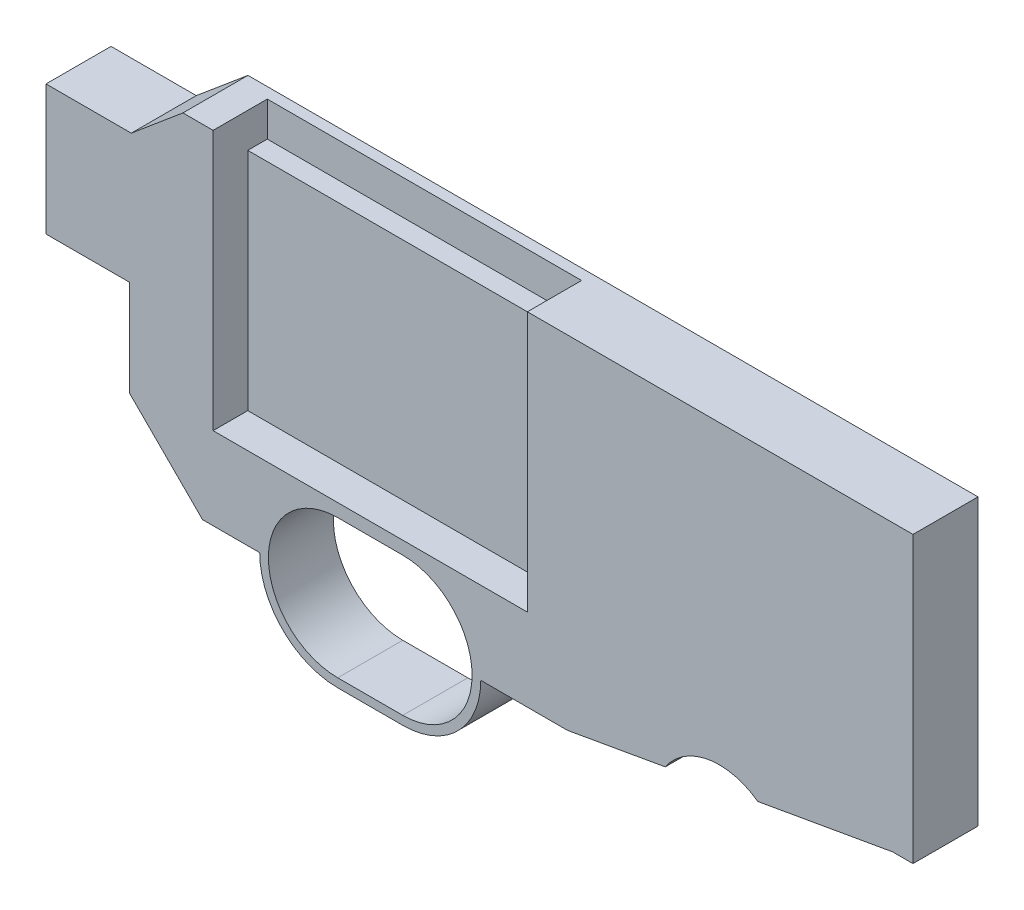
ISO-10303-21;
HEADER;
FILE_DESCRIPTION(('STEP AP214'),'2;1');
FILE_NAME('part.step','',(''),(''),'','','');
FILE_SCHEMA(('AUTOMOTIVE_DESIGN { 1 0 10303 214 1 1 1 1 }'));
ENDSEC;
DATA;
#1=APPLICATION_CONTEXT('core data for automotive mechanical design processes');
#2=APPLICATION_PROTOCOL_DEFINITION('international standard','automotive_design',2000,#1);
#3=PRODUCT_CONTEXT('',#1,'mechanical');
#4=PRODUCT('Part','Part','',(#3));
#5=PRODUCT_RELATED_PRODUCT_CATEGORY('part','',(#4));
#6=PRODUCT_DEFINITION_FORMATION('','',#4);
#7=PRODUCT_DEFINITION_CONTEXT('part definition',#1,'design');
#8=PRODUCT_DEFINITION('design','',#6,#7);
#9=PRODUCT_DEFINITION_SHAPE('','',#8);
#10=(LENGTH_UNIT() NAMED_UNIT(*) SI_UNIT(.MILLI.,.METRE.));
#11=(NAMED_UNIT(*) PLANE_ANGLE_UNIT() SI_UNIT($,.RADIAN.));
#12=(NAMED_UNIT(*) SI_UNIT($,.STERADIAN.) SOLID_ANGLE_UNIT());
#13=UNCERTAINTY_MEASURE_WITH_UNIT(LENGTH_MEASURE(1.E-05),#10,'distance_accuracy_value','');
#14=(GEOMETRIC_REPRESENTATION_CONTEXT(3) GLOBAL_UNCERTAINTY_ASSIGNED_CONTEXT((#13)) GLOBAL_UNIT_ASSIGNED_CONTEXT((#10,
#11,#12)) REPRESENTATION_CONTEXT('',''));
#15=CARTESIAN_POINT('',(0.,0.,0.));
#16=DIRECTION('',(0.,0.,1.));
#17=DIRECTION('',(1.,0.,0.));
#18=AXIS2_PLACEMENT_3D('',#15,#16,#17);
#19=CARTESIAN_POINT('',(0.,-69.,15.));
#20=DIRECTION('',(0.,1.,0.));
#21=DIRECTION('',(-1.,0.,0.));
#22=AXIS2_PLACEMENT_3D('',#19,#20,#21);
#23=PLANE('',#22);
#24=DIRECTION('',(1.,0.,0.));
#25=VECTOR('',#24,1.);
#26=CARTESIAN_POINT('',(0.,-69.,0.));
#27=LINE('',#26,#25);
#28=CARTESIAN_POINT('',(36.1113331220298,-69.,0.));
#29=VERTEX_POINT('',#28);
#30=CARTESIAN_POINT('',(49.2987248652,-69.,0.));
#31=VERTEX_POINT('',#30);
#32=EDGE_CURVE('E240',#29,#31,#27,.T.);
#33=ORIENTED_EDGE('',*,*,#32,.T.);
#34=DIRECTION('',(0.,0.,-1.));
#35=VECTOR('',#34,1.);
#36=CARTESIAN_POINT('',(49.2987248652,-69.,15.));
#37=LINE('',#36,#35);
#38=CARTESIAN_POINT('',(49.2987248652,-69.,15.));
#39=VERTEX_POINT('',#38);
#40=EDGE_CURVE('E11',#39,#31,#37,.T.);
#41=ORIENTED_EDGE('',*,*,#40,.F.);
#42=DIRECTION('',(1.,0.,0.));
#43=VECTOR('',#42,1.);
#44=CARTESIAN_POINT('',(0.,-69.,15.));
#45=LINE('',#44,#43);
#46=CARTESIAN_POINT('',(36.1113331220298,-69.,15.));
#47=VERTEX_POINT('',#46);
#48=EDGE_CURVE('E337',#47,#39,#45,.T.);
#49=ORIENTED_EDGE('',*,*,#48,.F.);
#50=DIRECTION('',(0.,0.,-1.));
#51=VECTOR('',#50,1.);
#52=CARTESIAN_POINT('',(36.1113331220298,-69.,15.));
#53=LINE('',#52,#51);
#54=EDGE_CURVE('E283',#47,#29,#53,.T.);
#55=ORIENTED_EDGE('',*,*,#54,.T.);
#56=EDGE_LOOP('',(#33,#41,#49,#55));
#57=FACE_BOUND('',#56,.T.);
#58=ADVANCED_FACE('F35',(#57),#23,.F.);
#59=CARTESIAN_POINT('',(67.2987248652,-69.,15.));
#60=DIRECTION('',(0.,0.,-1.));
#61=DIRECTION('',(-1.,0.,0.));
#62=AXIS2_PLACEMENT_3D('',#59,#60,#61);
#63=CYLINDRICAL_SURFACE('',#62,18.);
#64=CARTESIAN_POINT('',(67.2987248652,-69.,0.));
#65=DIRECTION('',(0.,0.,1.));
#66=DIRECTION('',(1.,0.,0.));
#67=AXIS2_PLACEMENT_3D('',#64,#65,#66);
#68=CIRCLE('',#67,18.);
#69=CARTESIAN_POINT('',(67.2987248652,-87.,0.));
#70=VERTEX_POINT('',#69);
#71=EDGE_CURVE('E243',#31,#70,#68,.T.);
#72=ORIENTED_EDGE('',*,*,#71,.T.);
#73=DIRECTION('',(0.,0.,-1.));
#74=VECTOR('',#73,1.);
#75=CARTESIAN_POINT('',(67.2987248652,-87.,15.));
#76=LINE('',#75,#74);
#77=CARTESIAN_POINT('',(67.2987248652,-87.,15.));
#78=VERTEX_POINT('',#77);
#79=EDGE_CURVE('E44',#78,#70,#76,.T.);
#80=ORIENTED_EDGE('',*,*,#79,.F.);
#81=CARTESIAN_POINT('',(67.2987248652,-69.,15.));
#82=DIRECTION('',(0.,0.,1.));
#83=DIRECTION('',(1.,0.,0.));
#84=AXIS2_PLACEMENT_3D('',#81,#82,#83);
#85=CIRCLE('',#84,18.);
#86=EDGE_CURVE('E344',#39,#78,#85,.T.);
#87=ORIENTED_EDGE('',*,*,#86,.F.);
#88=ORIENTED_EDGE('',*,*,#40,.T.);
#89=EDGE_LOOP('',(#72,#80,#87,#88));
#90=FACE_BOUND('',#89,.T.);
#91=ADVANCED_FACE('F397',(#90),#63,.T.);
#92=CARTESIAN_POINT('',(0.,-87.,15.));
#93=DIRECTION('',(0.,1.,0.));
#94=DIRECTION('',(0.,0.,1.));
#95=AXIS2_PLACEMENT_3D('',#92,#93,#94);
#96=PLANE('',#95);
#97=DIRECTION('',(1.,0.,0.));
#98=VECTOR('',#97,1.);
#99=CARTESIAN_POINT('',(0.,-87.,0.));
#100=LINE('',#99,#98);
#101=CARTESIAN_POINT('',(82.2987248652,-87.,0.));
#102=VERTEX_POINT('',#101);
#103=EDGE_CURVE('E245',#70,#102,#100,.T.);
#104=ORIENTED_EDGE('',*,*,#103,.T.);
#105=DIRECTION('',(0.,0.,-1.));
#106=VECTOR('',#105,1.);
#107=CARTESIAN_POINT('',(82.2987248652,-87.,15.));
#108=LINE('',#107,#106);
#109=CARTESIAN_POINT('',(82.2987248652,-87.,15.));
#110=VERTEX_POINT('',#109);
#111=EDGE_CURVE('E308',#110,#102,#108,.T.);
#112=ORIENTED_EDGE('',*,*,#111,.F.);
#113=DIRECTION('',(1.,0.,0.));
#114=VECTOR('',#113,1.);
#115=CARTESIAN_POINT('',(0.,-87.,15.));
#116=LINE('',#115,#114);
#117=EDGE_CURVE('E346',#78,#110,#116,.T.);
#118=ORIENTED_EDGE('',*,*,#117,.F.);
#119=ORIENTED_EDGE('',*,*,#79,.T.);
#120=EDGE_LOOP('',(#104,#112,#118,#119));
#121=FACE_BOUND('',#120,.T.);
#122=ADVANCED_FACE('F403',(#121),#96,.F.);
#123=CARTESIAN_POINT('',(82.2987248652,-69.,15.));
#124=DIRECTION('',(0.,0.,-1.));
#125=DIRECTION('',(-1.,0.,0.));
#126=AXIS2_PLACEMENT_3D('',#123,#124,#125);
#127=CYLINDRICAL_SURFACE('',#126,18.);
#128=CARTESIAN_POINT('',(82.2987248652,-69.,0.));
#129=DIRECTION('',(0.,0.,1.));
#130=DIRECTION('',(1.,0.,0.));
#131=AXIS2_PLACEMENT_3D('',#128,#129,#130);
#132=CIRCLE('',#131,18.);
#133=CARTESIAN_POINT('',(100.2987248652,-69.,0.));
#134=VERTEX_POINT('',#133);
#135=EDGE_CURVE('E247',#102,#134,#132,.T.);
#136=ORIENTED_EDGE('',*,*,#135,.T.);
#137=DIRECTION('',(0.,0.,-1.));
#138=VECTOR('',#137,1.);
#139=CARTESIAN_POINT('',(100.2987248652,-69.,15.));
#140=LINE('',#139,#138);
#141=CARTESIAN_POINT('',(100.2987248652,-69.,15.));
#142=VERTEX_POINT('',#141);
#143=EDGE_CURVE('E305',#142,#134,#140,.T.);
#144=ORIENTED_EDGE('',*,*,#143,.F.);
#145=CARTESIAN_POINT('',(82.2987248652,-69.,15.));
#146=DIRECTION('',(0.,0.,1.));
#147=DIRECTION('',(1.,0.,0.));
#148=AXIS2_PLACEMENT_3D('',#145,#146,#147);
#149=CIRCLE('',#148,18.);
#150=EDGE_CURVE('E348',#110,#142,#149,.T.);
#151=ORIENTED_EDGE('',*,*,#150,.F.);
#152=ORIENTED_EDGE('',*,*,#111,.T.);
#153=EDGE_LOOP('',(#136,#144,#151,#152));
#154=FACE_BOUND('',#153,.T.);
#155=ADVANCED_FACE('F567',(#154),#127,.T.);
#156=CARTESIAN_POINT('',(0.,-69.0000000000001,15.));
#157=DIRECTION('',(0.,1.,0.));
#158=DIRECTION('',(-1.,0.,0.));
#159=AXIS2_PLACEMENT_3D('',#156,#157,#158);
#160=PLANE('',#159);
#161=DIRECTION('',(1.,0.,0.));
#162=VECTOR('',#161,1.);
#163=CARTESIAN_POINT('',(0.,-69.0000000000001,0.));
#164=LINE('',#163,#162);
#165=CARTESIAN_POINT('',(120.2987248652,-69.,0.));
#166=VERTEX_POINT('',#165);
#167=EDGE_CURVE('E249',#134,#166,#164,.T.);
#168=ORIENTED_EDGE('',*,*,#167,.T.);
#169=DIRECTION('',(0.,0.,-1.));
#170=VECTOR('',#169,1.);
#171=CARTESIAN_POINT('',(120.2987248652,-69.,15.));
#172=LINE('',#171,#170);
#173=CARTESIAN_POINT('',(120.2987248652,-69.,15.));
#174=VERTEX_POINT('',#173);
#175=EDGE_CURVE('E303',#174,#166,#172,.T.);
#176=ORIENTED_EDGE('',*,*,#175,.F.);
#177=DIRECTION('',(1.,0.,0.));
#178=VECTOR('',#177,1.);
#179=CARTESIAN_POINT('',(0.,-69.0000000000001,15.));
#180=LINE('',#179,#178);
#181=EDGE_CURVE('E350',#142,#174,#180,.T.);
#182=ORIENTED_EDGE('',*,*,#181,.F.);
#183=ORIENTED_EDGE('',*,*,#143,.T.);
#184=EDGE_LOOP('',(#168,#176,#182,#183));
#185=FACE_BOUND('',#184,.T.);
#186=ADVANCED_FACE('F562',(#185),#160,.F.);
#187=CARTESIAN_POINT('',(15.4271453544443,-87.4916889772594,15.));
#188=DIRECTION('',(0.173648177666931,-0.984807753012208,0.));
#189=DIRECTION('',(0.984807753012208,0.173648177666931,0.));
#190=AXIS2_PLACEMENT_3D('',#187,#188,#189);
#191=PLANE('',#190);
#192=DIRECTION('',(-0.984807753012208,-0.173648177666931,0.));
#193=VECTOR('',#192,1.);
#194=CARTESIAN_POINT('',(15.4271453544443,-87.4916889772594,0.));
#195=LINE('',#194,#193);
#196=CARTESIAN_POINT('',(142.85786008007,-65.022215800168,0.));
#197=VERTEX_POINT('',#196);
#198=EDGE_CURVE('E252',#197,#166,#195,.T.);
#199=ORIENTED_EDGE('',*,*,#198,.F.);
#200=DIRECTION('',(0.,0.,-1.));
#201=VECTOR('',#200,1.);
#202=CARTESIAN_POINT('',(142.85786008007,-65.022215800168,15.));
#203=LINE('',#202,#201);
#204=CARTESIAN_POINT('',(142.85786008007,-65.022215800168,15.));
#205=VERTEX_POINT('',#204);
#206=EDGE_CURVE('E301',#205,#197,#203,.T.);
#207=ORIENTED_EDGE('',*,*,#206,.F.);
#208=DIRECTION('',(-0.984807753012208,-0.173648177666931,0.));
#209=VECTOR('',#208,1.);
#210=CARTESIAN_POINT('',(15.4271453544443,-87.4916889772594,15.));
#211=LINE('',#210,#209);
#212=EDGE_CURVE('E352',#205,#174,#211,.T.);
#213=ORIENTED_EDGE('',*,*,#212,.T.);
#214=ORIENTED_EDGE('',*,*,#175,.T.);
#215=EDGE_LOOP('',(#199,#207,#213,#214));
#216=FACE_BOUND('',#215,.T.);
#217=ADVANCED_FACE('F556',(#216),#191,.T.);
#218=CARTESIAN_POINT('',(155.326836155646,-73.3603592162237,15.));
#219=DIRECTION('',(0.,0.,-1.));
#220=DIRECTION('',(-1.,0.,0.));
#221=AXIS2_PLACEMENT_3D('',#218,#219,#220);
#222=CYLINDRICAL_SURFACE('',#221,15.);
#223=CARTESIAN_POINT('',(155.326836155646,-73.3603592162237,0.));
#224=DIRECTION('',(0.,0.,1.));
#225=DIRECTION('',(1.,0.,0.));
#226=AXIS2_PLACEMENT_3D('',#223,#224,#225);
#227=CIRCLE('',#226,15.);
#228=CARTESIAN_POINT('',(164.192027956391,-61.2604263926087,0.));
#229=VERTEX_POINT('',#228);
#230=EDGE_CURVE('E255',#229,#197,#227,.T.);
#231=ORIENTED_EDGE('',*,*,#230,.F.);
#232=DIRECTION('',(0.,0.,-1.));
#233=VECTOR('',#232,1.);
#234=CARTESIAN_POINT('',(164.192027956391,-61.2604263926087,15.));
#235=LINE('',#234,#233);
#236=CARTESIAN_POINT('',(164.192027956391,-61.2604263926087,15.));
#237=VERTEX_POINT('',#236);
#238=EDGE_CURVE('E299',#237,#229,#235,.T.);
#239=ORIENTED_EDGE('',*,*,#238,.F.);
#240=CARTESIAN_POINT('',(155.326836155646,-73.3603592162237,15.));
#241=DIRECTION('',(0.,0.,1.));
#242=DIRECTION('',(1.,0.,0.));
#243=AXIS2_PLACEMENT_3D('',#240,#241,#242);
#244=CIRCLE('',#243,15.);
#245=EDGE_CURVE('E355',#237,#205,#244,.T.);
#246=ORIENTED_EDGE('',*,*,#245,.T.);
#247=ORIENTED_EDGE('',*,*,#206,.T.);
#248=EDGE_LOOP('',(#231,#239,#246,#247));
#249=FACE_BOUND('',#248,.T.);
#250=ADVANCED_FACE('F551',(#249),#222,.F.);
#251=CARTESIAN_POINT('',(15.4271453544441,-87.4916889772591,15.));
#252=DIRECTION('',(-0.173648177666929,0.984807753012208,0.));
#253=DIRECTION('',(-0.984807753012208,-0.173648177666929,0.));
#254=AXIS2_PLACEMENT_3D('',#251,#252,#253);
#255=PLANE('',#254);
#256=DIRECTION('',(0.984807753012208,0.173648177666929,0.));
#257=VECTOR('',#256,1.);
#258=CARTESIAN_POINT('',(15.4271453544441,-87.4916889772591,0.));
#259=LINE('',#258,#257);
#260=CARTESIAN_POINT('',(195.2987248652,-55.7754764468651,0.));
#261=VERTEX_POINT('',#260);
#262=EDGE_CURVE('E258',#229,#261,#259,.T.);
#263=ORIENTED_EDGE('',*,*,#262,.T.);
#264=DIRECTION('',(0.,0.,-1.));
#265=VECTOR('',#264,1.);
#266=CARTESIAN_POINT('',(195.2987248652,-55.7754764468651,15.));
#267=LINE('',#266,#265);
#268=CARTESIAN_POINT('',(195.2987248652,-55.7754764468651,15.));
#269=VERTEX_POINT('',#268);
#270=EDGE_CURVE('E297',#269,#261,#267,.T.);
#271=ORIENTED_EDGE('',*,*,#270,.F.);
#272=DIRECTION('',(0.984807753012208,0.173648177666929,0.));
#273=VECTOR('',#272,1.);
#274=CARTESIAN_POINT('',(15.4271453544441,-87.4916889772591,15.));
#275=LINE('',#274,#273);
#276=EDGE_CURVE('E358',#237,#269,#275,.T.);
#277=ORIENTED_EDGE('',*,*,#276,.F.);
#278=ORIENTED_EDGE('',*,*,#238,.T.);
#279=EDGE_LOOP('',(#263,#271,#277,#278));
#280=FACE_BOUND('',#279,.T.);
#281=ADVANCED_FACE('F548',(#280),#255,.F.);
#282=CARTESIAN_POINT('',(0.,-55.7754764468648,15.));
#283=DIRECTION('',(0.,-1.,0.));
#284=DIRECTION('',(1.,0.,0.));
#285=AXIS2_PLACEMENT_3D('',#282,#283,#284);
#286=PLANE('',#285);
#287=DIRECTION('',(-1.,0.,0.));
#288=VECTOR('',#287,1.);
#289=CARTESIAN_POINT('',(0.,-55.7754764468648,0.));
#290=LINE('',#289,#288);
#291=CARTESIAN_POINT('',(200.,-55.7754764468651,0.));
#292=VERTEX_POINT('',#291);
#293=EDGE_CURVE('E261',#292,#261,#290,.T.);
#294=ORIENTED_EDGE('',*,*,#293,.F.);
#295=DIRECTION('',(0.,0.,-1.));
#296=VECTOR('',#295,1.);
#297=CARTESIAN_POINT('',(200.,-55.7754764468651,15.));
#298=LINE('',#297,#296);
#299=CARTESIAN_POINT('',(200.,-55.7754764468651,15.));
#300=VERTEX_POINT('',#299);
#301=EDGE_CURVE('E295',#300,#292,#298,.T.);
#302=ORIENTED_EDGE('',*,*,#301,.F.);
#303=DIRECTION('',(-1.,0.,0.));
#304=VECTOR('',#303,1.);
#305=CARTESIAN_POINT('',(0.,-55.7754764468648,15.));
#306=LINE('',#305,#304);
#307=EDGE_CURVE('E360',#300,#269,#306,.T.);
#308=ORIENTED_EDGE('',*,*,#307,.T.);
#309=ORIENTED_EDGE('',*,*,#270,.T.);
#310=EDGE_LOOP('',(#294,#302,#308,#309));
#311=FACE_BOUND('',#310,.T.);
#312=ADVANCED_FACE('F544',(#311),#286,.T.);
#313=CARTESIAN_POINT('',(200.,0.,15.));
#314=DIRECTION('',(1.,0.,0.));
#315=DIRECTION('',(0.,0.,-1.));
#316=AXIS2_PLACEMENT_3D('',#313,#314,#315);
#317=PLANE('',#316);
#318=DIRECTION('',(0.,-1.,0.));
#319=VECTOR('',#318,1.);
#320=CARTESIAN_POINT('',(200.,0.,0.));
#321=LINE('',#320,#319);
#322=CARTESIAN_POINT('',(200.,10.,0.));
#323=VERTEX_POINT('',#322);
#324=EDGE_CURVE('E264',#323,#292,#321,.T.);
#325=ORIENTED_EDGE('',*,*,#324,.F.);
#326=DIRECTION('',(0.,0.,-1.));
#327=VECTOR('',#326,1.);
#328=CARTESIAN_POINT('',(200.,10.,15.));
#329=LINE('',#328,#327);
#330=CARTESIAN_POINT('',(200.,10.,15.));
#331=VERTEX_POINT('',#330);
#332=EDGE_CURVE('E293',#331,#323,#329,.T.);
#333=ORIENTED_EDGE('',*,*,#332,.F.);
#334=DIRECTION('',(0.,-1.,0.));
#335=VECTOR('',#334,1.);
#336=CARTESIAN_POINT('',(200.,0.,15.));
#337=LINE('',#336,#335);
#338=EDGE_CURVE('E363',#331,#300,#337,.T.);
#339=ORIENTED_EDGE('',*,*,#338,.T.);
#340=ORIENTED_EDGE('',*,*,#301,.T.);
#341=EDGE_LOOP('',(#325,#333,#339,#340));
#342=FACE_BOUND('',#341,.T.);
#343=ADVANCED_FACE('F541',(#342),#317,.T.);
#344=CARTESIAN_POINT('',(0.,10.,15.));
#345=DIRECTION('',(0.,1.,0.));
#346=DIRECTION('',(0.,0.,1.));
#347=AXIS2_PLACEMENT_3D('',#344,#345,#346);
#348=PLANE('',#347);
#349=DIRECTION('',(0.,0.,1.));
#350=VECTOR('',#349,1.);
#351=CARTESIAN_POINT('',(38.5487248652,10.,2.5));
#352=LINE('',#351,#350);
#353=CARTESIAN_POINT('',(38.5487248652,10.,2.5));
#354=VERTEX_POINT('',#353);
#355=CARTESIAN_POINT('',(38.5487248652,10.,15.));
#356=VERTEX_POINT('',#355);
#357=EDGE_CURVE('E477',#354,#356,#352,.T.);
#358=ORIENTED_EDGE('',*,*,#357,.F.);
#359=DIRECTION('',(-1.,0.,0.));
#360=VECTOR('',#359,1.);
#361=CARTESIAN_POINT('',(38.5487248652,10.,2.5));
#362=LINE('',#361,#360);
#363=CARTESIAN_POINT('',(111.0487248652,10.,2.5));
#364=VERTEX_POINT('',#363);
#365=EDGE_CURVE('E465',#364,#354,#362,.T.);
#366=ORIENTED_EDGE('',*,*,#365,.F.);
#367=DIRECTION('',(0.,0.,1.));
#368=VECTOR('',#367,1.);
#369=CARTESIAN_POINT('',(111.0487248652,10.,2.5));
#370=LINE('',#369,#368);
#371=CARTESIAN_POINT('',(111.0487248652,10.,15.));
#372=VERTEX_POINT('',#371);
#373=EDGE_CURVE('E479',#364,#372,#370,.T.);
#374=ORIENTED_EDGE('',*,*,#373,.T.);
#375=DIRECTION('',(1.,0.,0.));
#376=VECTOR('',#375,1.);
#377=CARTESIAN_POINT('',(0.,10.,15.));
#378=LINE('',#377,#376);
#379=EDGE_CURVE('E366',#372,#331,#378,.T.);
#380=ORIENTED_EDGE('',*,*,#379,.T.);
#381=ORIENTED_EDGE('',*,*,#332,.T.);
#382=DIRECTION('',(1.,0.,0.));
#383=VECTOR('',#382,1.);
#384=CARTESIAN_POINT('',(0.,10.,0.));
#385=LINE('',#384,#383);
#386=CARTESIAN_POINT('',(31.588778807741,10.,0.));
#387=VERTEX_POINT('',#386);
#388=EDGE_CURVE('E267',#387,#323,#385,.T.);
#389=ORIENTED_EDGE('',*,*,#388,.F.);
#390=DIRECTION('',(0.,0.,-1.));
#391=VECTOR('',#390,1.);
#392=CARTESIAN_POINT('',(31.588778807741,10.,15.));
#393=LINE('',#392,#391);
#394=CARTESIAN_POINT('',(31.588778807741,10.,15.));
#395=VERTEX_POINT('',#394);
#396=EDGE_CURVE('E291',#395,#387,#393,.T.);
#397=ORIENTED_EDGE('',*,*,#396,.F.);
#398=EDGE_CURVE('E367',#395,#356,#378,.T.);
#399=ORIENTED_EDGE('',*,*,#398,.T.);
#400=EDGE_LOOP('',(#358,#366,#374,#380,#381,#389,#397,#399));
#401=FACE_BOUND('',#400,.T.);
#402=ADVANCED_FACE('F525',(#401),#348,.T.);
#403=CARTESIAN_POINT('',(8.12768370146549,-9.68619625069088,15.));
#404=DIRECTION('',(-0.64278760968654,0.766044443118977,0.));
#405=DIRECTION('',(-0.766044443118977,-0.64278760968654,0.));
#406=AXIS2_PLACEMENT_3D('',#403,#404,#405);
#407=PLANE('',#406);
#408=DIRECTION('',(0.766044443118977,0.64278760968654,0.));
#409=VECTOR('',#408,1.);
#410=CARTESIAN_POINT('',(8.12768370146549,-9.68619625069088,0.));
#411=LINE('',#410,#409);
#412=CARTESIAN_POINT('',(19.6712428817989,0.,0.));
#413=VERTEX_POINT('',#412);
#414=EDGE_CURVE('E270',#413,#387,#411,.T.);
#415=ORIENTED_EDGE('',*,*,#414,.F.);
#416=DIRECTION('',(0.,0.,-1.));
#417=VECTOR('',#416,1.);
#418=CARTESIAN_POINT('',(19.6712428817989,0.,15.));
#419=LINE('',#418,#417);
#420=CARTESIAN_POINT('',(19.6712428817989,0.,15.));
#421=VERTEX_POINT('',#420);
#422=EDGE_CURVE('E289',#421,#413,#419,.T.);
#423=ORIENTED_EDGE('',*,*,#422,.F.);
#424=DIRECTION('',(0.766044443118977,0.64278760968654,0.));
#425=VECTOR('',#424,1.);
#426=CARTESIAN_POINT('',(8.12768370146549,-9.68619625069088,15.));
#427=LINE('',#426,#425);
#428=EDGE_CURVE('E370',#421,#395,#427,.T.);
#429=ORIENTED_EDGE('',*,*,#428,.T.);
#430=ORIENTED_EDGE('',*,*,#396,.T.);
#431=EDGE_LOOP('',(#415,#423,#429,#430));
#432=FACE_BOUND('',#431,.T.);
#433=ADVANCED_FACE('F382',(#432),#407,.T.);
#434=CARTESIAN_POINT('',(0.,0.,15.));
#435=DIRECTION('',(0.,1.,0.));
#436=DIRECTION('',(0.,0.,1.));
#437=AXIS2_PLACEMENT_3D('',#434,#435,#436);
#438=PLANE('',#437);
#439=DIRECTION('',(1.,0.,0.));
#440=VECTOR('',#439,1.);
#441=CARTESIAN_POINT('',(0.,0.,0.));
#442=LINE('',#441,#440);
#443=CARTESIAN_POINT('',(0.,0.,0.));
#444=VERTEX_POINT('',#443);
#445=EDGE_CURVE('E273',#444,#413,#442,.T.);
#446=ORIENTED_EDGE('',*,*,#445,.F.);
#447=DIRECTION('',(0.,0.,-1.));
#448=VECTOR('',#447,1.);
#449=CARTESIAN_POINT('',(0.,0.,15.));
#450=LINE('',#449,#448);
#451=CARTESIAN_POINT('',(0.,0.,15.));
#452=VERTEX_POINT('',#451);
#453=EDGE_CURVE('E287',#452,#444,#450,.T.);
#454=ORIENTED_EDGE('',*,*,#453,.F.);
#455=DIRECTION('',(1.,0.,0.));
#456=VECTOR('',#455,1.);
#457=CARTESIAN_POINT('',(0.,0.,15.));
#458=LINE('',#457,#456);
#459=EDGE_CURVE('E373',#452,#421,#458,.T.);
#460=ORIENTED_EDGE('',*,*,#459,.T.);
#461=ORIENTED_EDGE('',*,*,#422,.T.);
#462=EDGE_LOOP('',(#446,#454,#460,#461));
#463=FACE_BOUND('',#462,.T.);
#464=ADVANCED_FACE('F377',(#463),#438,.T.);
#465=CARTESIAN_POINT('',(0.,0.,15.));
#466=DIRECTION('',(1.,0.,0.));
#467=DIRECTION('',(0.,1.,0.));
#468=AXIS2_PLACEMENT_3D('',#465,#466,#467);
#469=PLANE('',#468);
#470=DIRECTION('',(0.,-1.,0.));
#471=VECTOR('',#470,1.);
#472=CARTESIAN_POINT('',(0.,0.,0.));
#473=LINE('',#472,#471);
#474=CARTESIAN_POINT('',(0.,-30.,0.));
#475=VERTEX_POINT('',#474);
#476=EDGE_CURVE('E276',#444,#475,#473,.T.);
#477=ORIENTED_EDGE('',*,*,#476,.T.);
#478=DIRECTION('',(0.,0.,-1.));
#479=VECTOR('',#478,1.);
#480=CARTESIAN_POINT('',(0.,-30.,15.));
#481=LINE('',#480,#479);
#482=CARTESIAN_POINT('',(0.,-30.,15.));
#483=VERTEX_POINT('',#482);
#484=EDGE_CURVE('E218',#483,#475,#481,.T.);
#485=ORIENTED_EDGE('',*,*,#484,.F.);
#486=DIRECTION('',(0.,-1.,0.));
#487=VECTOR('',#486,1.);
#488=CARTESIAN_POINT('',(0.,0.,15.));
#489=LINE('',#488,#487);
#490=EDGE_CURVE('E206',#452,#483,#489,.T.);
#491=ORIENTED_EDGE('',*,*,#490,.F.);
#492=ORIENTED_EDGE('',*,*,#453,.T.);
#493=EDGE_LOOP('',(#477,#485,#491,#492));
#494=FACE_BOUND('',#493,.T.);
#495=ADVANCED_FACE('F387',(#494),#469,.F.);
#496=CARTESIAN_POINT('',(0.,-30.,15.));
#497=DIRECTION('',(0.,1.,0.));
#498=DIRECTION('',(0.,0.,1.));
#499=AXIS2_PLACEMENT_3D('',#496,#497,#498);
#500=PLANE('',#499);
#501=DIRECTION('',(1.,0.,0.));
#502=VECTOR('',#501,1.);
#503=CARTESIAN_POINT('',(0.,-30.,0.));
#504=LINE('',#503,#502);
#505=CARTESIAN_POINT('',(19.2987248652,-30.,0.));
#506=VERTEX_POINT('',#505);
#507=EDGE_CURVE('E215',#475,#506,#504,.T.);
#508=ORIENTED_EDGE('',*,*,#507,.T.);
#509=DIRECTION('',(0.,0.,-1.));
#510=VECTOR('',#509,1.);
#511=CARTESIAN_POINT('',(19.2987248652,-30.,15.));
#512=LINE('',#511,#510);
#513=CARTESIAN_POINT('',(19.2987248652,-30.,15.));
#514=VERTEX_POINT('',#513);
#515=EDGE_CURVE('E212',#514,#506,#512,.T.);
#516=ORIENTED_EDGE('',*,*,#515,.F.);
#517=DIRECTION('',(1.,0.,0.));
#518=VECTOR('',#517,1.);
#519=CARTESIAN_POINT('',(0.,-30.,15.));
#520=LINE('',#519,#518);
#521=EDGE_CURVE('E197',#483,#514,#520,.T.);
#522=ORIENTED_EDGE('',*,*,#521,.F.);
#523=ORIENTED_EDGE('',*,*,#484,.T.);
#524=EDGE_LOOP('',(#508,#516,#522,#523));
#525=FACE_BOUND('',#524,.T.);
#526=ADVANCED_FACE('F213',(#525),#500,.F.);
#527=CARTESIAN_POINT('',(19.2987248652,0.,15.));
#528=DIRECTION('',(1.,0.,0.));
#529=DIRECTION('',(0.,1.,0.));
#530=AXIS2_PLACEMENT_3D('',#527,#528,#529);
#531=PLANE('',#530);
#532=DIRECTION('',(0.,-1.,0.));
#533=VECTOR('',#532,1.);
#534=CARTESIAN_POINT('',(19.2987248652,0.,0.));
#535=LINE('',#534,#533);
#536=CARTESIAN_POINT('',(19.2987248652,-52.1873917431703,0.));
#537=VERTEX_POINT('',#536);
#538=EDGE_CURVE('E279',#506,#537,#535,.T.);
#539=ORIENTED_EDGE('',*,*,#538,.T.);
#540=DIRECTION('',(0.,0.,-1.));
#541=VECTOR('',#540,1.);
#542=CARTESIAN_POINT('',(19.2987248652,-52.1873917431703,15.));
#543=LINE('',#542,#541);
#544=CARTESIAN_POINT('',(19.2987248652,-52.1873917431703,15.));
#545=VERTEX_POINT('',#544);
#546=EDGE_CURVE('E219',#545,#537,#543,.T.);
#547=ORIENTED_EDGE('',*,*,#546,.F.);
#548=DIRECTION('',(0.,-1.,0.));
#549=VECTOR('',#548,1.);
#550=CARTESIAN_POINT('',(19.2987248652,0.,15.));
#551=LINE('',#550,#549);
#552=EDGE_CURVE('E202',#514,#545,#551,.T.);
#553=ORIENTED_EDGE('',*,*,#552,.F.);
#554=ORIENTED_EDGE('',*,*,#515,.T.);
#555=EDGE_LOOP('',(#539,#547,#553,#554));
#556=FACE_BOUND('',#555,.T.);
#557=ADVANCED_FACE('F221',(#556),#531,.F.);
#558=CARTESIAN_POINT('',(82.2987248652,-69.,15.));
#559=DIRECTION('',(0.,0.,-1.));
#560=DIRECTION('',(-1.,0.,0.));
#561=AXIS2_PLACEMENT_3D('',#558,#559,#560);
#562=CYLINDRICAL_SURFACE('',#561,16.);
#563=CARTESIAN_POINT('',(82.2987248652,-69.,0.));
#564=DIRECTION('',(0.,0.,1.));
#565=DIRECTION('',(1.,0.,0.));
#566=AXIS2_PLACEMENT_3D('',#563,#564,#565);
#567=CIRCLE('',#566,16.);
#568=CARTESIAN_POINT('',(82.2987248652,-85.,0.));
#569=VERTEX_POINT('',#568);
#570=CARTESIAN_POINT('',(82.2987248652,-53.,0.));
#571=VERTEX_POINT('',#570);
#572=EDGE_CURVE('E227',#569,#571,#567,.T.);
#573=ORIENTED_EDGE('',*,*,#572,.F.);
#574=DIRECTION('',(0.,0.,-1.));
#575=VECTOR('',#574,1.);
#576=CARTESIAN_POINT('',(82.2987248652,-85.,15.));
#577=LINE('',#576,#575);
#578=CARTESIAN_POINT('',(82.2987248652,-85.,15.));
#579=VERTEX_POINT('',#578);
#580=EDGE_CURVE('E39',#579,#569,#577,.T.);
#581=ORIENTED_EDGE('',*,*,#580,.F.);
#582=CARTESIAN_POINT('',(82.2987248652,-69.,15.));
#583=DIRECTION('',(0.,0.,1.));
#584=DIRECTION('',(1.,0.,0.));
#585=AXIS2_PLACEMENT_3D('',#582,#583,#584);
#586=CIRCLE('',#585,16.);
#587=CARTESIAN_POINT('',(82.2987248652,-53.,15.));
#588=VERTEX_POINT('',#587);
#589=EDGE_CURVE('E282',#579,#588,#586,.T.);
#590=ORIENTED_EDGE('',*,*,#589,.T.);
#591=DIRECTION('',(0.,0.,-1.));
#592=VECTOR('',#591,1.);
#593=CARTESIAN_POINT('',(82.2987248652,-53.,15.));
#594=LINE('',#593,#592);
#595=EDGE_CURVE('E223',#588,#571,#594,.T.);
#596=ORIENTED_EDGE('',*,*,#595,.T.);
#597=EDGE_LOOP('',(#573,#581,#590,#596));
#598=FACE_BOUND('',#597,.T.);
#599=ADVANCED_FACE('F37',(#598),#562,.F.);
#600=CARTESIAN_POINT('',(0.,-85.,15.));
#601=DIRECTION('',(0.,1.,0.));
#602=DIRECTION('',(0.,0.,1.));
#603=AXIS2_PLACEMENT_3D('',#600,#601,#602);
#604=PLANE('',#603);
#605=DIRECTION('',(1.,0.,0.));
#606=VECTOR('',#605,1.);
#607=CARTESIAN_POINT('',(0.,-85.,0.));
#608=LINE('',#607,#606);
#609=CARTESIAN_POINT('',(67.2987248652,-85.,0.));
#610=VERTEX_POINT('',#609);
#611=EDGE_CURVE('E230',#610,#569,#608,.T.);
#612=ORIENTED_EDGE('',*,*,#611,.F.);
#613=DIRECTION('',(0.,0.,-1.));
#614=VECTOR('',#613,1.);
#615=CARTESIAN_POINT('',(67.2987248652,-85.,15.));
#616=LINE('',#615,#614);
#617=CARTESIAN_POINT('',(67.2987248652,-85.,15.));
#618=VERTEX_POINT('',#617);
#619=EDGE_CURVE('E315',#618,#610,#616,.T.);
#620=ORIENTED_EDGE('',*,*,#619,.F.);
#621=DIRECTION('',(1.,0.,0.));
#622=VECTOR('',#621,1.);
#623=CARTESIAN_POINT('',(0.,-85.,15.));
#624=LINE('',#623,#622);
#625=EDGE_CURVE('E324',#618,#579,#624,.T.);
#626=ORIENTED_EDGE('',*,*,#625,.T.);
#627=ORIENTED_EDGE('',*,*,#580,.T.);
#628=EDGE_LOOP('',(#612,#620,#626,#627));
#629=FACE_BOUND('',#628,.T.);
#630=ADVANCED_FACE('F322',(#629),#604,.T.);
#631=CARTESIAN_POINT('',(67.2987248652,-69.,15.));
#632=DIRECTION('',(0.,0.,-1.));
#633=DIRECTION('',(-1.,0.,0.));
#634=AXIS2_PLACEMENT_3D('',#631,#632,#633);
#635=CYLINDRICAL_SURFACE('',#634,16.);
#636=CARTESIAN_POINT('',(67.2987248652,-69.,0.));
#637=DIRECTION('',(0.,0.,1.));
#638=DIRECTION('',(1.,0.,0.));
#639=AXIS2_PLACEMENT_3D('',#636,#637,#638);
#640=CIRCLE('',#639,16.);
#641=CARTESIAN_POINT('',(67.2987248652,-53.,0.));
#642=VERTEX_POINT('',#641);
#643=EDGE_CURVE('E234',#642,#610,#640,.T.);
#644=ORIENTED_EDGE('',*,*,#643,.F.);
#645=DIRECTION('',(0.,0.,-1.));
#646=VECTOR('',#645,1.);
#647=CARTESIAN_POINT('',(67.2987248652,-53.,15.));
#648=LINE('',#647,#646);
#649=CARTESIAN_POINT('',(67.2987248652,-53.,15.));
#650=VERTEX_POINT('',#649);
#651=EDGE_CURVE('E314',#650,#642,#648,.T.);
#652=ORIENTED_EDGE('',*,*,#651,.F.);
#653=CARTESIAN_POINT('',(67.2987248652,-69.,15.));
#654=DIRECTION('',(0.,0.,1.));
#655=DIRECTION('',(1.,0.,0.));
#656=AXIS2_PLACEMENT_3D('',#653,#654,#655);
#657=CIRCLE('',#656,16.);
#658=EDGE_CURVE('E333',#650,#618,#657,.T.);
#659=ORIENTED_EDGE('',*,*,#658,.T.);
#660=ORIENTED_EDGE('',*,*,#619,.T.);
#661=EDGE_LOOP('',(#644,#652,#659,#660));
#662=FACE_BOUND('',#661,.T.);
#663=ADVANCED_FACE('F330',(#662),#635,.F.);
#664=CARTESIAN_POINT('',(0.,-53.,15.));
#665=DIRECTION('',(0.,1.,0.));
#666=DIRECTION('',(-1.,0.,0.));
#667=AXIS2_PLACEMENT_3D('',#664,#665,#666);
#668=PLANE('',#667);
#669=DIRECTION('',(1.,0.,0.));
#670=VECTOR('',#669,1.);
#671=CARTESIAN_POINT('',(0.,-53.,0.));
#672=LINE('',#671,#670);
#673=EDGE_CURVE('E237',#642,#571,#672,.T.);
#674=ORIENTED_EDGE('',*,*,#673,.T.);
#675=ORIENTED_EDGE('',*,*,#595,.F.);
#676=DIRECTION('',(1.,0.,0.));
#677=VECTOR('',#676,1.);
#678=CARTESIAN_POINT('',(0.,-53.,15.));
#679=LINE('',#678,#677);
#680=EDGE_CURVE('E335',#650,#588,#679,.T.);
#681=ORIENTED_EDGE('',*,*,#680,.F.);
#682=ORIENTED_EDGE('',*,*,#651,.T.);
#683=EDGE_LOOP('',(#674,#675,#681,#682));
#684=FACE_BOUND('',#683,.T.);
#685=ADVANCED_FACE('F336',(#684),#668,.F.);
#686=CARTESIAN_POINT('',(-16.4443334389852,-16.4443334389853,15.));
#687=DIRECTION('',(0.707106781186546,0.707106781186549,0.));
#688=DIRECTION('',(-0.707106781186549,0.707106781186546,0.));
#689=AXIS2_PLACEMENT_3D('',#686,#687,#688);
#690=PLANE('',#689);
#691=DIRECTION('',(0.707106781186549,-0.707106781186546,0.));
#692=VECTOR('',#691,1.);
#693=CARTESIAN_POINT('',(-16.4443334389852,-16.4443334389853,0.));
#694=LINE('',#693,#692);
#695=EDGE_CURVE('E133',#537,#29,#694,.T.);
#696=ORIENTED_EDGE('',*,*,#695,.T.);
#697=ORIENTED_EDGE('',*,*,#54,.F.);
#698=DIRECTION('',(0.707106781186549,-0.707106781186546,0.));
#699=VECTOR('',#698,1.);
#700=CARTESIAN_POINT('',(-16.4443334389852,-16.4443334389853,15.));
#701=LINE('',#700,#699);
#702=EDGE_CURVE('E61',#545,#47,#701,.T.);
#703=ORIENTED_EDGE('',*,*,#702,.F.);
#704=ORIENTED_EDGE('',*,*,#546,.T.);
#705=EDGE_LOOP('',(#696,#697,#703,#704));
#706=FACE_BOUND('',#705,.T.);
#707=ADVANCED_FACE('F410',(#706),#690,.F.);
#708=CARTESIAN_POINT('',(0.,0.,15.));
#709=DIRECTION('',(0.,0.,1.));
#710=DIRECTION('',(1.,0.,0.));
#711=AXIS2_PLACEMENT_3D('',#708,#709,#710);
#712=PLANE('',#711);
#713=DIRECTION('',(0.,-1.,0.));
#714=VECTOR('',#713,1.);
#715=CARTESIAN_POINT('',(38.5487248652,2.,15.));
#716=LINE('',#715,#714);
#717=CARTESIAN_POINT('',(38.5487248652,-50.,15.));
#718=VERTEX_POINT('',#717);
#719=EDGE_CURVE('E52',#356,#718,#716,.T.);
#720=ORIENTED_EDGE('',*,*,#719,.F.);
#721=ORIENTED_EDGE('',*,*,#398,.F.);
#722=ORIENTED_EDGE('',*,*,#428,.F.);
#723=ORIENTED_EDGE('',*,*,#459,.F.);
#724=ORIENTED_EDGE('',*,*,#490,.T.);
#725=ORIENTED_EDGE('',*,*,#521,.T.);
#726=ORIENTED_EDGE('',*,*,#552,.T.);
#727=ORIENTED_EDGE('',*,*,#702,.T.);
#728=ORIENTED_EDGE('',*,*,#48,.T.);
#729=ORIENTED_EDGE('',*,*,#86,.T.);
#730=ORIENTED_EDGE('',*,*,#117,.T.);
#731=ORIENTED_EDGE('',*,*,#150,.T.);
#732=ORIENTED_EDGE('',*,*,#181,.T.);
#733=ORIENTED_EDGE('',*,*,#212,.F.);
#734=ORIENTED_EDGE('',*,*,#245,.F.);
#735=ORIENTED_EDGE('',*,*,#276,.T.);
#736=ORIENTED_EDGE('',*,*,#307,.F.);
#737=ORIENTED_EDGE('',*,*,#338,.F.);
#738=ORIENTED_EDGE('',*,*,#379,.F.);
#739=DIRECTION('',(0.,1.,0.));
#740=VECTOR('',#739,1.);
#741=CARTESIAN_POINT('',(111.0487248652,2.,15.));
#742=LINE('',#741,#740);
#743=CARTESIAN_POINT('',(111.0487248652,-50.,15.));
#744=VERTEX_POINT('',#743);
#745=EDGE_CURVE('E491',#744,#372,#742,.T.);
#746=ORIENTED_EDGE('',*,*,#745,.F.);
#747=DIRECTION('',(1.,0.,0.));
#748=VECTOR('',#747,1.);
#749=CARTESIAN_POINT('',(38.5487248652,-50.,15.));
#750=LINE('',#749,#748);
#751=EDGE_CURVE('E502',#718,#744,#750,.T.);
#752=ORIENTED_EDGE('',*,*,#751,.F.);
#753=EDGE_LOOP('',(#720,#721,#722,#723,#724,#725,#726,#727,#728,#729,#730,#731,#732,#733,#734,
#735,#736,#737,#738,#746,#752));
#754=FACE_BOUND('',#753,.T.);
#755=ORIENTED_EDGE('',*,*,#589,.F.);
#756=ORIENTED_EDGE('',*,*,#625,.F.);
#757=ORIENTED_EDGE('',*,*,#658,.F.);
#758=ORIENTED_EDGE('',*,*,#680,.T.);
#759=EDGE_LOOP('',(#755,#756,#757,#758));
#760=FACE_BOUND('',#759,.T.);
#761=ADVANCED_FACE('F199',(#754,#760),#712,.T.);
#762=CARTESIAN_POINT('',(0.,0.,0.));
#763=DIRECTION('',(0.,0.,1.));
#764=DIRECTION('',(1.,0.,0.));
#765=AXIS2_PLACEMENT_3D('',#762,#763,#764);
#766=PLANE('',#765);
#767=ORIENTED_EDGE('',*,*,#572,.T.);
#768=ORIENTED_EDGE('',*,*,#673,.F.);
#769=ORIENTED_EDGE('',*,*,#643,.T.);
#770=ORIENTED_EDGE('',*,*,#611,.T.);
#771=EDGE_LOOP('',(#767,#768,#769,#770));
#772=FACE_BOUND('',#771,.T.);
#773=ORIENTED_EDGE('',*,*,#32,.F.);
#774=ORIENTED_EDGE('',*,*,#695,.F.);
#775=ORIENTED_EDGE('',*,*,#538,.F.);
#776=ORIENTED_EDGE('',*,*,#507,.F.);
#777=ORIENTED_EDGE('',*,*,#476,.F.);
#778=ORIENTED_EDGE('',*,*,#445,.T.);
#779=ORIENTED_EDGE('',*,*,#414,.T.);
#780=ORIENTED_EDGE('',*,*,#388,.T.);
#781=ORIENTED_EDGE('',*,*,#324,.T.);
#782=ORIENTED_EDGE('',*,*,#293,.T.);
#783=ORIENTED_EDGE('',*,*,#262,.F.);
#784=ORIENTED_EDGE('',*,*,#230,.T.);
#785=ORIENTED_EDGE('',*,*,#198,.T.);
#786=ORIENTED_EDGE('',*,*,#167,.F.);
#787=ORIENTED_EDGE('',*,*,#135,.F.);
#788=ORIENTED_EDGE('',*,*,#103,.F.);
#789=ORIENTED_EDGE('',*,*,#71,.F.);
#790=EDGE_LOOP('',(#773,#774,#775,#776,#777,#778,#779,#780,#781,#782,#783,#784,#785,#786,#787,
#788,#789));
#791=FACE_BOUND('',#790,.T.);
#792=ADVANCED_FACE('F328',(#772,#791),#766,.F.);
#793=CARTESIAN_POINT('',(38.5487248652,2.,7.));
#794=DIRECTION('',(-1.,0.,0.));
#795=DIRECTION('',(0.,-1.,0.));
#796=AXIS2_PLACEMENT_3D('',#793,#794,#795);
#797=PLANE('',#796);
#798=ORIENTED_EDGE('',*,*,#719,.T.);
#799=DIRECTION('',(0.,0.,1.));
#800=VECTOR('',#799,1.);
#801=CARTESIAN_POINT('',(38.5487248652,-50.,7.));
#802=LINE('',#801,#800);
#803=CARTESIAN_POINT('',(38.5487248652,-50.,7.));
#804=VERTEX_POINT('',#803);
#805=EDGE_CURVE('E500',#804,#718,#802,.T.);
#806=ORIENTED_EDGE('',*,*,#805,.F.);
#807=DIRECTION('',(0.,-1.,0.));
#808=VECTOR('',#807,1.);
#809=CARTESIAN_POINT('',(38.5487248652,2.,7.));
#810=LINE('',#809,#808);
#811=CARTESIAN_POINT('',(38.5487248652,2.,7.));
#812=VERTEX_POINT('',#811);
#813=EDGE_CURVE('E487',#812,#804,#810,.T.);
#814=ORIENTED_EDGE('',*,*,#813,.F.);
#815=DIRECTION('',(0.,0.,1.));
#816=VECTOR('',#815,1.);
#817=CARTESIAN_POINT('',(38.5487248652,2.,2.5));
#818=LINE('',#817,#816);
#819=CARTESIAN_POINT('',(38.5487248652,2.,2.5));
#820=VERTEX_POINT('',#819);
#821=EDGE_CURVE('E476',#820,#812,#818,.T.);
#822=ORIENTED_EDGE('',*,*,#821,.F.);
#823=DIRECTION('',(0.,-1.,0.));
#824=VECTOR('',#823,1.);
#825=CARTESIAN_POINT('',(38.5487248652,10.,2.5));
#826=LINE('',#825,#824);
#827=EDGE_CURVE('E458',#354,#820,#826,.T.);
#828=ORIENTED_EDGE('',*,*,#827,.F.);
#829=ORIENTED_EDGE('',*,*,#357,.T.);
#830=EDGE_LOOP('',(#798,#806,#814,#822,#828,#829));
#831=FACE_BOUND('',#830,.T.);
#832=ADVANCED_FACE('F427',(#831),#797,.F.);
#833=CARTESIAN_POINT('',(111.0487248652,2.,7.));
#834=DIRECTION('',(1.,0.,0.));
#835=DIRECTION('',(0.,0.,-1.));
#836=AXIS2_PLACEMENT_3D('',#833,#834,#835);
#837=PLANE('',#836);
#838=ORIENTED_EDGE('',*,*,#745,.T.);
#839=ORIENTED_EDGE('',*,*,#373,.F.);
#840=DIRECTION('',(0.,1.,0.));
#841=VECTOR('',#840,1.);
#842=CARTESIAN_POINT('',(111.0487248652,10.,2.5));
#843=LINE('',#842,#841);
#844=CARTESIAN_POINT('',(111.0487248652,2.,2.5));
#845=VERTEX_POINT('',#844);
#846=EDGE_CURVE('E471',#845,#364,#843,.T.);
#847=ORIENTED_EDGE('',*,*,#846,.F.);
#848=DIRECTION('',(0.,0.,1.));
#849=VECTOR('',#848,1.);
#850=CARTESIAN_POINT('',(111.0487248652,2.,2.5));
#851=LINE('',#850,#849);
#852=CARTESIAN_POINT('',(111.0487248652,2.,7.));
#853=VERTEX_POINT('',#852);
#854=EDGE_CURVE('E482',#845,#853,#851,.T.);
#855=ORIENTED_EDGE('',*,*,#854,.T.);
#856=DIRECTION('',(0.,1.,0.));
#857=VECTOR('',#856,1.);
#858=CARTESIAN_POINT('',(111.0487248652,2.,7.));
#859=LINE('',#858,#857);
#860=CARTESIAN_POINT('',(111.0487248652,-50.,7.));
#861=VERTEX_POINT('',#860);
#862=EDGE_CURVE('E494',#861,#853,#859,.T.);
#863=ORIENTED_EDGE('',*,*,#862,.F.);
#864=DIRECTION('',(0.,0.,1.));
#865=VECTOR('',#864,1.);
#866=CARTESIAN_POINT('',(111.0487248652,-50.,7.));
#867=LINE('',#866,#865);
#868=EDGE_CURVE('E231',#861,#744,#867,.T.);
#869=ORIENTED_EDGE('',*,*,#868,.T.);
#870=EDGE_LOOP('',(#838,#839,#847,#855,#863,#869));
#871=FACE_BOUND('',#870,.T.);
#872=ADVANCED_FACE('F432',(#871),#837,.F.);
#873=CARTESIAN_POINT('',(38.5487248652,-50.,7.));
#874=DIRECTION('',(0.,-1.,0.));
#875=DIRECTION('',(0.,0.,-1.));
#876=AXIS2_PLACEMENT_3D('',#873,#874,#875);
#877=PLANE('',#876);
#878=ORIENTED_EDGE('',*,*,#751,.T.);
#879=ORIENTED_EDGE('',*,*,#868,.F.);
#880=DIRECTION('',(1.,0.,0.));
#881=VECTOR('',#880,1.);
#882=CARTESIAN_POINT('',(38.5487248652,-50.,7.));
#883=LINE('',#882,#881);
#884=EDGE_CURVE('E490',#804,#861,#883,.T.);
#885=ORIENTED_EDGE('',*,*,#884,.F.);
#886=ORIENTED_EDGE('',*,*,#805,.T.);
#887=EDGE_LOOP('',(#878,#879,#885,#886));
#888=FACE_BOUND('',#887,.T.);
#889=ADVANCED_FACE('F433',(#888),#877,.F.);
#890=CARTESIAN_POINT('',(0.,0.,7.));
#891=DIRECTION('',(0.,0.,1.));
#892=DIRECTION('',(1.,0.,0.));
#893=AXIS2_PLACEMENT_3D('',#890,#891,#892);
#894=PLANE('',#893);
#895=ORIENTED_EDGE('',*,*,#813,.T.);
#896=ORIENTED_EDGE('',*,*,#884,.T.);
#897=ORIENTED_EDGE('',*,*,#862,.T.);
#898=DIRECTION('',(-1.,0.,0.));
#899=VECTOR('',#898,1.);
#900=CARTESIAN_POINT('',(38.5487248652,2.,7.));
#901=LINE('',#900,#899);
#902=EDGE_CURVE('E497',#853,#812,#901,.T.);
#903=ORIENTED_EDGE('',*,*,#902,.T.);
#904=EDGE_LOOP('',(#895,#896,#897,#903));
#905=FACE_BOUND('',#904,.T.);
#906=ADVANCED_FACE('F436',(#905),#894,.T.);
#907=CARTESIAN_POINT('',(38.5487248652,2.,2.5));
#908=DIRECTION('',(0.,-1.,0.));
#909=DIRECTION('',(0.,0.,-1.));
#910=AXIS2_PLACEMENT_3D('',#907,#908,#909);
#911=PLANE('',#910);
#912=ORIENTED_EDGE('',*,*,#902,.F.);
#913=ORIENTED_EDGE('',*,*,#854,.F.);
#914=DIRECTION('',(1.,0.,0.));
#915=VECTOR('',#914,1.);
#916=CARTESIAN_POINT('',(38.5487248652,2.,2.5));
#917=LINE('',#916,#915);
#918=EDGE_CURVE('E462',#820,#845,#917,.T.);
#919=ORIENTED_EDGE('',*,*,#918,.F.);
#920=ORIENTED_EDGE('',*,*,#821,.T.);
#921=EDGE_LOOP('',(#912,#913,#919,#920));
#922=FACE_BOUND('',#921,.T.);
#923=ADVANCED_FACE('F443',(#922),#911,.F.);
#924=CARTESIAN_POINT('',(0.,0.,2.5));
#925=DIRECTION('',(0.,0.,1.));
#926=DIRECTION('',(1.,0.,0.));
#927=AXIS2_PLACEMENT_3D('',#924,#925,#926);
#928=PLANE('',#927);
#929=ORIENTED_EDGE('',*,*,#827,.T.);
#930=ORIENTED_EDGE('',*,*,#918,.T.);
#931=ORIENTED_EDGE('',*,*,#846,.T.);
#932=ORIENTED_EDGE('',*,*,#365,.T.);
#933=EDGE_LOOP('',(#929,#930,#931,#932));
#934=FACE_BOUND('',#933,.T.);
#935=ADVANCED_FACE('F447',(#934),#928,.T.);
#936=CLOSED_SHELL('',(#58,#91,#122,#155,#186,#217,#250,#281,#312,#343,#402,#433,#464,#495,#526,
#557,#599,#630,#663,#685,#707,#761,#792,#832,#872,#889,#906,#923,#935));
#937=MANIFOLD_SOLID_BREP('B2',#936);
#938=ADVANCED_BREP_SHAPE_REPRESENTATION('',(#18,#937),#14);
#939=SHAPE_DEFINITION_REPRESENTATION(#9,#938);
ENDSEC;
END-ISO-10303-21;
